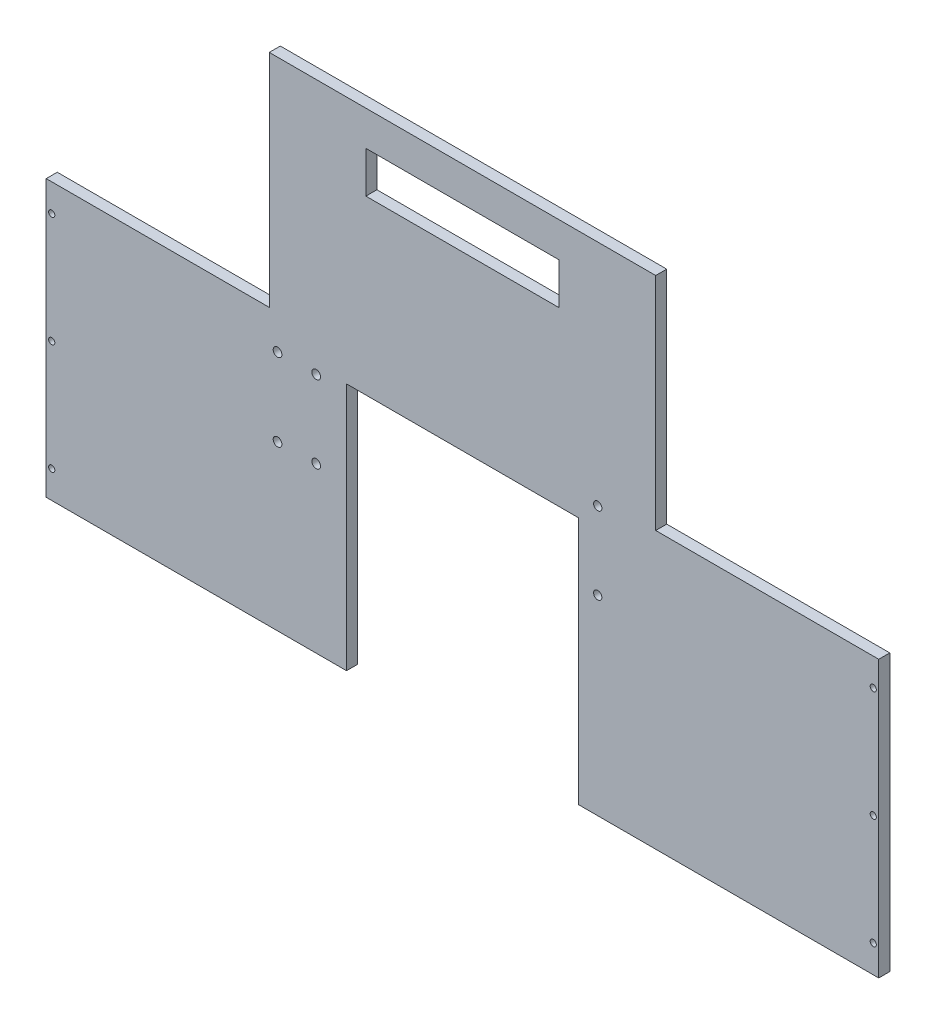
ISO-10303-21;
HEADER;
FILE_DESCRIPTION(('STEP AP214'),'2;1');
FILE_NAME('part.step','',(''),(''),'','','');
FILE_SCHEMA(('AUTOMOTIVE_DESIGN { 1 0 10303 214 1 1 1 1 }'));
ENDSEC;
DATA;
#1=APPLICATION_CONTEXT('core data for automotive mechanical design processes');
#2=APPLICATION_PROTOCOL_DEFINITION('international standard','automotive_design',2000,#1);
#3=PRODUCT_CONTEXT('',#1,'mechanical');
#4=PRODUCT('Part','Part','',(#3));
#5=PRODUCT_RELATED_PRODUCT_CATEGORY('part','',(#4));
#6=PRODUCT_DEFINITION_FORMATION('','',#4);
#7=PRODUCT_DEFINITION_CONTEXT('part definition',#1,'design');
#8=PRODUCT_DEFINITION('design','',#6,#7);
#9=PRODUCT_DEFINITION_SHAPE('','',#8);
#10=(LENGTH_UNIT() NAMED_UNIT(*) SI_UNIT(.MILLI.,.METRE.));
#11=(NAMED_UNIT(*) PLANE_ANGLE_UNIT() SI_UNIT($,.RADIAN.));
#12=(NAMED_UNIT(*) SI_UNIT($,.STERADIAN.) SOLID_ANGLE_UNIT());
#13=UNCERTAINTY_MEASURE_WITH_UNIT(LENGTH_MEASURE(1.E-05),#10,'distance_accuracy_value','');
#14=(GEOMETRIC_REPRESENTATION_CONTEXT(3) GLOBAL_UNCERTAINTY_ASSIGNED_CONTEXT((#13)) GLOBAL_UNIT_ASSIGNED_CONTEXT((#10,
#11,#12)) REPRESENTATION_CONTEXT('',''));
#15=CARTESIAN_POINT('',(0.,0.,0.));
#16=DIRECTION('',(0.,0.,1.));
#17=DIRECTION('',(1.,0.,0.));
#18=AXIS2_PLACEMENT_3D('',#15,#16,#17);
#19=CARTESIAN_POINT('',(0.,0.,5.08));
#20=DIRECTION('',(1.,0.,0.));
#21=DIRECTION('',(0.,1.,0.));
#22=AXIS2_PLACEMENT_3D('',#19,#20,#21);
#23=PLANE('',#22);
#24=DIRECTION('',(0.,0.,-1.));
#25=VECTOR('',#24,1.);
#26=CARTESIAN_POINT('',(0.,127.,5.08));
#27=LINE('',#26,#25);
#28=CARTESIAN_POINT('',(0.,127.,5.08));
#29=VERTEX_POINT('',#28);
#30=CARTESIAN_POINT('',(0.,127.,0.));
#31=VERTEX_POINT('',#30);
#32=EDGE_CURVE('E238',#29,#31,#27,.T.);
#33=ORIENTED_EDGE('',*,*,#32,.F.);
#34=DIRECTION('',(0.,-1.,0.));
#35=VECTOR('',#34,1.);
#36=CARTESIAN_POINT('',(0.,0.,5.08));
#37=LINE('',#36,#35);
#38=CARTESIAN_POINT('',(0.,228.6,5.08));
#39=VERTEX_POINT('',#38);
#40=EDGE_CURVE('E345',#39,#29,#37,.T.);
#41=ORIENTED_EDGE('',*,*,#40,.F.);
#42=DIRECTION('',(0.,0.,-1.));
#43=VECTOR('',#42,1.);
#44=CARTESIAN_POINT('',(0.,228.6,5.08));
#45=LINE('',#44,#43);
#46=CARTESIAN_POINT('',(0.,228.6,0.));
#47=VERTEX_POINT('',#46);
#48=EDGE_CURVE('E349',#39,#47,#45,.T.);
#49=ORIENTED_EDGE('',*,*,#48,.T.);
#50=DIRECTION('',(0.,-1.,0.));
#51=VECTOR('',#50,1.);
#52=CARTESIAN_POINT('',(0.,0.,0.));
#53=LINE('',#52,#51);
#54=EDGE_CURVE('E327',#47,#31,#53,.T.);
#55=ORIENTED_EDGE('',*,*,#54,.T.);
#56=EDGE_LOOP('',(#33,#41,#49,#55));
#57=FACE_BOUND('',#56,.T.);
#58=ADVANCED_FACE('F57',(#57),#23,.F.);
#59=CARTESIAN_POINT('',(35.56,0.,5.08));
#60=DIRECTION('',(0.,1.,0.));
#61=DIRECTION('',(-1.,0.,0.));
#62=AXIS2_PLACEMENT_3D('',#59,#60,#61);
#63=PLANE('',#62);
#64=DIRECTION('',(1.,0.,0.));
#65=VECTOR('',#64,1.);
#66=CARTESIAN_POINT('',(35.56,0.,0.));
#67=LINE('',#66,#65);
#68=CARTESIAN_POINT('',(-102.616,0.,0.));
#69=VERTEX_POINT('',#68);
#70=CARTESIAN_POINT('',(35.56,0.,0.));
#71=VERTEX_POINT('',#70);
#72=EDGE_CURVE('E318',#69,#71,#67,.T.);
#73=ORIENTED_EDGE('',*,*,#72,.T.);
#74=DIRECTION('',(0.,0.,-1.));
#75=VECTOR('',#74,1.);
#76=CARTESIAN_POINT('',(35.56,0.,5.08));
#77=LINE('',#76,#75);
#78=CARTESIAN_POINT('',(35.56,0.,5.08));
#79=VERTEX_POINT('',#78);
#80=EDGE_CURVE('E12',#79,#71,#77,.T.);
#81=ORIENTED_EDGE('',*,*,#80,.F.);
#82=DIRECTION('',(1.,0.,0.));
#83=VECTOR('',#82,1.);
#84=CARTESIAN_POINT('',(35.56,0.,5.08));
#85=LINE('',#84,#83);
#86=CARTESIAN_POINT('',(-102.616,0.,5.08));
#87=VERTEX_POINT('',#86);
#88=EDGE_CURVE('E322',#87,#79,#85,.T.);
#89=ORIENTED_EDGE('',*,*,#88,.F.);
#90=DIRECTION('',(0.,0.,-1.));
#91=VECTOR('',#90,1.);
#92=CARTESIAN_POINT('',(-102.616,0.,5.08));
#93=LINE('',#92,#91);
#94=EDGE_CURVE('E229',#87,#69,#93,.T.);
#95=ORIENTED_EDGE('',*,*,#94,.T.);
#96=EDGE_LOOP('',(#73,#81,#89,#95));
#97=FACE_BOUND('',#96,.T.);
#98=ADVANCED_FACE('F59',(#97),#63,.F.);
#99=CARTESIAN_POINT('',(35.56,114.3,5.08));
#100=DIRECTION('',(-1.,0.,0.));
#101=DIRECTION('',(0.,-1.,0.));
#102=AXIS2_PLACEMENT_3D('',#99,#100,#101);
#103=PLANE('',#102);
#104=DIRECTION('',(0.,1.,0.));
#105=VECTOR('',#104,1.);
#106=CARTESIAN_POINT('',(35.56,114.3,0.));
#107=LINE('',#106,#105);
#108=CARTESIAN_POINT('',(35.56,114.3,0.));
#109=VERTEX_POINT('',#108);
#110=EDGE_CURVE('E353',#71,#109,#107,.T.);
#111=ORIENTED_EDGE('',*,*,#110,.T.);
#112=DIRECTION('',(0.,0.,-1.));
#113=VECTOR('',#112,1.);
#114=CARTESIAN_POINT('',(35.56,114.3,5.08));
#115=LINE('',#114,#113);
#116=CARTESIAN_POINT('',(35.56,114.3,5.08));
#117=VERTEX_POINT('',#116);
#118=EDGE_CURVE('E66',#117,#109,#115,.T.);
#119=ORIENTED_EDGE('',*,*,#118,.F.);
#120=DIRECTION('',(0.,1.,0.));
#121=VECTOR('',#120,1.);
#122=CARTESIAN_POINT('',(35.56,114.3,5.08));
#123=LINE('',#122,#121);
#124=EDGE_CURVE('E326',#79,#117,#123,.T.);
#125=ORIENTED_EDGE('',*,*,#124,.F.);
#126=ORIENTED_EDGE('',*,*,#80,.T.);
#127=EDGE_LOOP('',(#111,#119,#125,#126));
#128=FACE_BOUND('',#127,.T.);
#129=ADVANCED_FACE('F413',(#128),#103,.F.);
#130=CARTESIAN_POINT('',(142.24,114.3,5.08));
#131=DIRECTION('',(0.,1.,0.));
#132=DIRECTION('',(-1.,0.,0.));
#133=AXIS2_PLACEMENT_3D('',#130,#131,#132);
#134=PLANE('',#133);
#135=DIRECTION('',(1.,0.,0.));
#136=VECTOR('',#135,1.);
#137=CARTESIAN_POINT('',(142.24,114.3,0.));
#138=LINE('',#137,#136);
#139=CARTESIAN_POINT('',(142.24,114.3,0.));
#140=VERTEX_POINT('',#139);
#141=EDGE_CURVE('E356',#109,#140,#138,.T.);
#142=ORIENTED_EDGE('',*,*,#141,.T.);
#143=DIRECTION('',(0.,0.,-1.));
#144=VECTOR('',#143,1.);
#145=CARTESIAN_POINT('',(142.24,114.3,5.08));
#146=LINE('',#145,#144);
#147=CARTESIAN_POINT('',(142.24,114.3,5.08));
#148=VERTEX_POINT('',#147);
#149=EDGE_CURVE('E384',#148,#140,#146,.T.);
#150=ORIENTED_EDGE('',*,*,#149,.F.);
#151=DIRECTION('',(1.,0.,0.));
#152=VECTOR('',#151,1.);
#153=CARTESIAN_POINT('',(142.24,114.3,5.08));
#154=LINE('',#153,#152);
#155=EDGE_CURVE('E330',#117,#148,#154,.T.);
#156=ORIENTED_EDGE('',*,*,#155,.F.);
#157=ORIENTED_EDGE('',*,*,#118,.T.);
#158=EDGE_LOOP('',(#142,#150,#156,#157));
#159=FACE_BOUND('',#158,.T.);
#160=ADVANCED_FACE('F393',(#159),#134,.F.);
#161=CARTESIAN_POINT('',(142.24,0.,5.08));
#162=DIRECTION('',(1.,0.,0.));
#163=DIRECTION('',(0.,0.,-1.));
#164=AXIS2_PLACEMENT_3D('',#161,#162,#163);
#165=PLANE('',#164);
#166=DIRECTION('',(0.,-1.,0.));
#167=VECTOR('',#166,1.);
#168=CARTESIAN_POINT('',(142.24,0.,0.));
#169=LINE('',#168,#167);
#170=CARTESIAN_POINT('',(142.24,0.,0.));
#171=VERTEX_POINT('',#170);
#172=EDGE_CURVE('E359',#140,#171,#169,.T.);
#173=ORIENTED_EDGE('',*,*,#172,.T.);
#174=DIRECTION('',(0.,0.,-1.));
#175=VECTOR('',#174,1.);
#176=CARTESIAN_POINT('',(142.24,0.,5.08));
#177=LINE('',#176,#175);
#178=CARTESIAN_POINT('',(142.24,0.,5.08));
#179=VERTEX_POINT('',#178);
#180=EDGE_CURVE('E380',#179,#171,#177,.T.);
#181=ORIENTED_EDGE('',*,*,#180,.F.);
#182=DIRECTION('',(0.,-1.,0.));
#183=VECTOR('',#182,1.);
#184=CARTESIAN_POINT('',(142.24,0.,5.08));
#185=LINE('',#184,#183);
#186=EDGE_CURVE('E333',#148,#179,#185,.T.);
#187=ORIENTED_EDGE('',*,*,#186,.F.);
#188=ORIENTED_EDGE('',*,*,#149,.T.);
#189=EDGE_LOOP('',(#173,#181,#187,#188));
#190=FACE_BOUND('',#189,.T.);
#191=ADVANCED_FACE('F401',(#190),#165,.F.);
#192=CARTESIAN_POINT('',(177.8,0.,5.08));
#193=DIRECTION('',(0.,1.,0.));
#194=DIRECTION('',(-1.,0.,0.));
#195=AXIS2_PLACEMENT_3D('',#192,#193,#194);
#196=PLANE('',#195);
#197=DIRECTION('',(1.,0.,0.));
#198=VECTOR('',#197,1.);
#199=CARTESIAN_POINT('',(177.8,0.,0.));
#200=LINE('',#199,#198);
#201=CARTESIAN_POINT('',(280.416,0.,0.));
#202=VERTEX_POINT('',#201);
#203=EDGE_CURVE('E362',#171,#202,#200,.T.);
#204=ORIENTED_EDGE('',*,*,#203,.T.);
#205=DIRECTION('',(0.,0.,-1.));
#206=VECTOR('',#205,1.);
#207=CARTESIAN_POINT('',(280.416,0.,5.08));
#208=LINE('',#207,#206);
#209=CARTESIAN_POINT('',(280.416,0.,5.08));
#210=VERTEX_POINT('',#209);
#211=EDGE_CURVE('E219',#210,#202,#208,.T.);
#212=ORIENTED_EDGE('',*,*,#211,.F.);
#213=DIRECTION('',(1.,0.,0.));
#214=VECTOR('',#213,1.);
#215=CARTESIAN_POINT('',(177.8,0.,5.08));
#216=LINE('',#215,#214);
#217=EDGE_CURVE('E336',#179,#210,#216,.T.);
#218=ORIENTED_EDGE('',*,*,#217,.F.);
#219=ORIENTED_EDGE('',*,*,#180,.T.);
#220=EDGE_LOOP('',(#204,#212,#218,#219));
#221=FACE_BOUND('',#220,.T.);
#222=ADVANCED_FACE('F405',(#221),#196,.F.);
#223=CARTESIAN_POINT('',(177.8,228.6,5.08));
#224=DIRECTION('',(-1.,0.,0.));
#225=DIRECTION('',(0.,-1.,0.));
#226=AXIS2_PLACEMENT_3D('',#223,#224,#225);
#227=PLANE('',#226);
#228=DIRECTION('',(0.,1.,0.));
#229=VECTOR('',#228,1.);
#230=CARTESIAN_POINT('',(177.8,228.6,5.08));
#231=LINE('',#230,#229);
#232=CARTESIAN_POINT('',(177.8,127.,5.08));
#233=VERTEX_POINT('',#232);
#234=CARTESIAN_POINT('',(177.8,228.6,5.08));
#235=VERTEX_POINT('',#234);
#236=EDGE_CURVE('E339',#233,#235,#231,.T.);
#237=ORIENTED_EDGE('',*,*,#236,.F.);
#238=DIRECTION('',(0.,0.,-1.));
#239=VECTOR('',#238,1.);
#240=CARTESIAN_POINT('',(177.8,127.,5.08));
#241=LINE('',#240,#239);
#242=CARTESIAN_POINT('',(177.8,127.,0.));
#243=VERTEX_POINT('',#242);
#244=EDGE_CURVE('E249',#233,#243,#241,.T.);
#245=ORIENTED_EDGE('',*,*,#244,.T.);
#246=DIRECTION('',(0.,1.,0.));
#247=VECTOR('',#246,1.);
#248=CARTESIAN_POINT('',(177.8,228.6,0.));
#249=LINE('',#248,#247);
#250=CARTESIAN_POINT('',(177.8,228.6,0.));
#251=VERTEX_POINT('',#250);
#252=EDGE_CURVE('E365',#243,#251,#249,.T.);
#253=ORIENTED_EDGE('',*,*,#252,.T.);
#254=DIRECTION('',(0.,0.,-1.));
#255=VECTOR('',#254,1.);
#256=CARTESIAN_POINT('',(177.8,228.6,5.08));
#257=LINE('',#256,#255);
#258=EDGE_CURVE('E376',#235,#251,#257,.T.);
#259=ORIENTED_EDGE('',*,*,#258,.F.);
#260=EDGE_LOOP('',(#237,#245,#253,#259));
#261=FACE_BOUND('',#260,.T.);
#262=ADVANCED_FACE('F434',(#261),#227,.F.);
#263=CARTESIAN_POINT('',(0.,228.6,5.08));
#264=DIRECTION('',(0.,-1.,0.));
#265=DIRECTION('',(1.,0.,0.));
#266=AXIS2_PLACEMENT_3D('',#263,#264,#265);
#267=PLANE('',#266);
#268=DIRECTION('',(-1.,0.,0.));
#269=VECTOR('',#268,1.);
#270=CARTESIAN_POINT('',(0.,228.6,0.));
#271=LINE('',#270,#269);
#272=EDGE_CURVE('E368',#251,#47,#271,.T.);
#273=ORIENTED_EDGE('',*,*,#272,.T.);
#274=ORIENTED_EDGE('',*,*,#48,.F.);
#275=DIRECTION('',(-1.,0.,0.));
#276=VECTOR('',#275,1.);
#277=CARTESIAN_POINT('',(0.,228.6,5.08));
#278=LINE('',#277,#276);
#279=EDGE_CURVE('E342',#235,#39,#278,.T.);
#280=ORIENTED_EDGE('',*,*,#279,.F.);
#281=ORIENTED_EDGE('',*,*,#258,.T.);
#282=EDGE_LOOP('',(#273,#274,#280,#281));
#283=FACE_BOUND('',#282,.T.);
#284=ADVANCED_FACE('F430',(#283),#267,.F.);
#285=CARTESIAN_POINT('',(0.,0.,5.08));
#286=DIRECTION('',(0.,0.,-1.));
#287=DIRECTION('',(-1.,0.,0.));
#288=AXIS2_PLACEMENT_3D('',#285,#286,#287);
#289=PLANE('',#288);
#290=CARTESIAN_POINT('',(277.876,12.7,5.08));
#291=DIRECTION('',(0.,0.,-1.));
#292=DIRECTION('',(-1.,0.,0.));
#293=AXIS2_PLACEMENT_3D('',#290,#291,#292);
#294=CIRCLE('',#293,1.42239999999999);
#295=CARTESIAN_POINT('',(276.4536,12.7,5.08));
#296=VERTEX_POINT('',#295);
#297=EDGE_CURVE('E714',#296,#296,#294,.T.);
#298=ORIENTED_EDGE('',*,*,#297,.T.);
#299=EDGE_LOOP('',(#298));
#300=FACE_BOUND('',#299,.T.);
#301=CARTESIAN_POINT('',(277.876,114.3,5.08));
#302=DIRECTION('',(0.,0.,-1.));
#303=DIRECTION('',(-1.,0.,0.));
#304=AXIS2_PLACEMENT_3D('',#301,#302,#303);
#305=CIRCLE('',#304,1.4224);
#306=CARTESIAN_POINT('',(276.4536,114.3,5.08));
#307=VERTEX_POINT('',#306);
#308=EDGE_CURVE('E716',#307,#307,#305,.T.);
#309=ORIENTED_EDGE('',*,*,#308,.T.);
#310=EDGE_LOOP('',(#309));
#311=FACE_BOUND('',#310,.T.);
#312=CARTESIAN_POINT('',(277.876,63.5,5.08));
#313=DIRECTION('',(0.,0.,-1.));
#314=DIRECTION('',(-1.,0.,0.));
#315=AXIS2_PLACEMENT_3D('',#312,#313,#314);
#316=CIRCLE('',#315,1.4224);
#317=CARTESIAN_POINT('',(276.4536,63.5,5.08));
#318=VERTEX_POINT('',#317);
#319=EDGE_CURVE('E721',#318,#318,#316,.T.);
#320=ORIENTED_EDGE('',*,*,#319,.T.);
#321=EDGE_LOOP('',(#320));
#322=FACE_BOUND('',#321,.T.);
#323=CARTESIAN_POINT('',(-100.076,114.3,5.08));
#324=DIRECTION('',(0.,0.,-1.));
#325=DIRECTION('',(-1.,0.,0.));
#326=AXIS2_PLACEMENT_3D('',#323,#324,#325);
#327=CIRCLE('',#326,1.42240000000004);
#328=CARTESIAN_POINT('',(-101.4984,114.3,5.08));
#329=VERTEX_POINT('',#328);
#330=EDGE_CURVE('E727',#329,#329,#327,.T.);
#331=ORIENTED_EDGE('',*,*,#330,.T.);
#332=EDGE_LOOP('',(#331));
#333=FACE_BOUND('',#332,.T.);
#334=CARTESIAN_POINT('',(-100.076,63.5,5.08));
#335=DIRECTION('',(0.,0.,-1.));
#336=DIRECTION('',(-1.,0.,0.));
#337=AXIS2_PLACEMENT_3D('',#334,#335,#336);
#338=CIRCLE('',#337,1.42240000000001);
#339=CARTESIAN_POINT('',(-101.4984,63.5,5.08));
#340=VERTEX_POINT('',#339);
#341=EDGE_CURVE('E731',#340,#340,#338,.T.);
#342=ORIENTED_EDGE('',*,*,#341,.T.);
#343=EDGE_LOOP('',(#342));
#344=FACE_BOUND('',#343,.T.);
#345=CARTESIAN_POINT('',(-100.076,12.7,5.08));
#346=DIRECTION('',(0.,0.,-1.));
#347=DIRECTION('',(-1.,0.,0.));
#348=AXIS2_PLACEMENT_3D('',#345,#346,#347);
#349=CIRCLE('',#348,1.42240000000002);
#350=CARTESIAN_POINT('',(-101.4984,12.7,5.08));
#351=VERTEX_POINT('',#350);
#352=EDGE_CURVE('E735',#351,#351,#349,.T.);
#353=ORIENTED_EDGE('',*,*,#352,.T.);
#354=EDGE_LOOP('',(#353));
#355=FACE_BOUND('',#354,.T.);
#356=DIRECTION('',(1.,0.,0.));
#357=VECTOR('',#356,1.);
#358=CARTESIAN_POINT('',(0.,212.598,5.08));
#359=LINE('',#358,#357);
#360=CARTESIAN_POINT('',(44.45,212.598,5.08));
#361=VERTEX_POINT('',#360);
#362=CARTESIAN_POINT('',(133.35,212.598,5.08));
#363=VERTEX_POINT('',#362);
#364=EDGE_CURVE('E211',#361,#363,#359,.T.);
#365=ORIENTED_EDGE('',*,*,#364,.T.);
#366=DIRECTION('',(0.,-1.,0.));
#367=VECTOR('',#366,1.);
#368=CARTESIAN_POINT('',(133.35,0.,5.08));
#369=LINE('',#368,#367);
#370=CARTESIAN_POINT('',(133.35,193.548,5.08));
#371=VERTEX_POINT('',#370);
#372=EDGE_CURVE('E215',#363,#371,#369,.T.);
#373=ORIENTED_EDGE('',*,*,#372,.T.);
#374=DIRECTION('',(-1.,0.,0.));
#375=VECTOR('',#374,1.);
#376=CARTESIAN_POINT('',(0.,193.548,5.08));
#377=LINE('',#376,#375);
#378=CARTESIAN_POINT('',(44.45,193.548,5.08));
#379=VERTEX_POINT('',#378);
#380=EDGE_CURVE('E202',#371,#379,#377,.T.);
#381=ORIENTED_EDGE('',*,*,#380,.T.);
#382=DIRECTION('',(0.,1.,0.));
#383=VECTOR('',#382,1.);
#384=CARTESIAN_POINT('',(44.45,0.,5.08));
#385=LINE('',#384,#383);
#386=EDGE_CURVE('E177',#379,#361,#385,.T.);
#387=ORIENTED_EDGE('',*,*,#386,.T.);
#388=EDGE_LOOP('',(#365,#373,#381,#387));
#389=FACE_BOUND('',#388,.T.);
#390=CARTESIAN_POINT('',(151.122459790118,123.444,5.08));
#391=DIRECTION('',(0.,0.,-1.));
#392=DIRECTION('',(-1.,0.,0.));
#393=AXIS2_PLACEMENT_3D('',#390,#391,#392);
#394=CIRCLE('',#393,1.90499999999999);
#395=CARTESIAN_POINT('',(149.217459790118,123.444,5.08));
#396=VERTEX_POINT('',#395);
#397=EDGE_CURVE('E274',#396,#396,#394,.T.);
#398=ORIENTED_EDGE('',*,*,#397,.T.);
#399=EDGE_LOOP('',(#398));
#400=FACE_BOUND('',#399,.T.);
#401=CARTESIAN_POINT('',(151.122459790118,87.884,5.08));
#402=DIRECTION('',(0.,0.,-1.));
#403=DIRECTION('',(-1.,0.,0.));
#404=AXIS2_PLACEMENT_3D('',#401,#402,#403);
#405=CIRCLE('',#404,1.90499999999999);
#406=CARTESIAN_POINT('',(149.217459790118,87.884,5.08));
#407=VERTEX_POINT('',#406);
#408=EDGE_CURVE('E283',#407,#407,#405,.T.);
#409=ORIENTED_EDGE('',*,*,#408,.T.);
#410=EDGE_LOOP('',(#409));
#411=FACE_BOUND('',#410,.T.);
#412=CARTESIAN_POINT('',(21.59,111.071616711567,5.08));
#413=DIRECTION('',(0.,0.,-1.));
#414=DIRECTION('',(-1.,0.,0.));
#415=AXIS2_PLACEMENT_3D('',#412,#413,#414);
#416=CIRCLE('',#415,2.);
#417=CARTESIAN_POINT('',(19.59,111.071616711567,5.08));
#418=VERTEX_POINT('',#417);
#419=EDGE_CURVE('E303',#418,#418,#416,.T.);
#420=ORIENTED_EDGE('',*,*,#419,.T.);
#421=EDGE_LOOP('',(#420));
#422=FACE_BOUND('',#421,.T.);
#423=CARTESIAN_POINT('',(3.81102803840513,75.3204205065202,5.08));
#424=DIRECTION('',(0.,0.,-1.));
#425=DIRECTION('',(-1.,0.,0.));
#426=AXIS2_PLACEMENT_3D('',#423,#424,#425);
#427=CIRCLE('',#426,2.00000000000001);
#428=CARTESIAN_POINT('',(1.81102803840513,75.3204205065202,5.08));
#429=VERTEX_POINT('',#428);
#430=EDGE_CURVE('E294',#429,#429,#427,.T.);
#431=ORIENTED_EDGE('',*,*,#430,.T.);
#432=EDGE_LOOP('',(#431));
#433=FACE_BOUND('',#432,.T.);
#434=CARTESIAN_POINT('',(3.81102803840514,111.071616711567,5.08));
#435=DIRECTION('',(0.,0.,-1.));
#436=DIRECTION('',(-1.,0.,0.));
#437=AXIS2_PLACEMENT_3D('',#434,#435,#436);
#438=CIRCLE('',#437,2.00000000000001);
#439=CARTESIAN_POINT('',(1.81102803840513,111.071616711567,5.08));
#440=VERTEX_POINT('',#439);
#441=EDGE_CURVE('E278',#440,#440,#438,.T.);
#442=ORIENTED_EDGE('',*,*,#441,.T.);
#443=EDGE_LOOP('',(#442));
#444=FACE_BOUND('',#443,.T.);
#445=CARTESIAN_POINT('',(21.59,75.511616711567,5.08));
#446=DIRECTION('',(0.,0.,-1.));
#447=DIRECTION('',(-1.,0.,0.));
#448=AXIS2_PLACEMENT_3D('',#445,#446,#447);
#449=CIRCLE('',#448,2.00000000000001);
#450=CARTESIAN_POINT('',(19.59,75.511616711567,5.08));
#451=VERTEX_POINT('',#450);
#452=EDGE_CURVE('E314',#451,#451,#449,.T.);
#453=ORIENTED_EDGE('',*,*,#452,.T.);
#454=EDGE_LOOP('',(#453));
#455=FACE_BOUND('',#454,.T.);
#456=ORIENTED_EDGE('',*,*,#88,.T.);
#457=ORIENTED_EDGE('',*,*,#124,.T.);
#458=ORIENTED_EDGE('',*,*,#155,.T.);
#459=ORIENTED_EDGE('',*,*,#186,.T.);
#460=ORIENTED_EDGE('',*,*,#217,.T.);
#461=DIRECTION('',(0.,-1.,0.));
#462=VECTOR('',#461,1.);
#463=CARTESIAN_POINT('',(280.416,127.,5.08));
#464=LINE('',#463,#462);
#465=CARTESIAN_POINT('',(280.416,127.,5.08));
#466=VERTEX_POINT('',#465);
#467=EDGE_CURVE('E253',#466,#210,#464,.T.);
#468=ORIENTED_EDGE('',*,*,#467,.F.);
#469=DIRECTION('',(1.,0.,0.));
#470=VECTOR('',#469,1.);
#471=CARTESIAN_POINT('',(177.8,127.,5.08));
#472=LINE('',#471,#470);
#473=EDGE_CURVE('E264',#233,#466,#472,.T.);
#474=ORIENTED_EDGE('',*,*,#473,.F.);
#475=ORIENTED_EDGE('',*,*,#236,.T.);
#476=ORIENTED_EDGE('',*,*,#279,.T.);
#477=ORIENTED_EDGE('',*,*,#40,.T.);
#478=DIRECTION('',(1.,0.,0.));
#479=VECTOR('',#478,1.);
#480=CARTESIAN_POINT('',(0.,127.,5.08));
#481=LINE('',#480,#479);
#482=CARTESIAN_POINT('',(-102.616,127.,5.08));
#483=VERTEX_POINT('',#482);
#484=EDGE_CURVE('E224',#483,#29,#481,.T.);
#485=ORIENTED_EDGE('',*,*,#484,.F.);
#486=DIRECTION('',(0.,1.,0.));
#487=VECTOR('',#486,1.);
#488=CARTESIAN_POINT('',(-102.616,127.,5.08));
#489=LINE('',#488,#487);
#490=EDGE_CURVE('E220',#87,#483,#489,.T.);
#491=ORIENTED_EDGE('',*,*,#490,.F.);
#492=EDGE_LOOP('',(#456,#457,#458,#459,#460,#468,#474,#475,#476,#477,#485,#491));
#493=FACE_BOUND('',#492,.T.);
#494=ADVANCED_FACE('F409',(#300,#311,#322,#333,#344,#355,#389,#400,#411,#422,#433,#444,#455,
#493),#289,.F.);
#495=CARTESIAN_POINT('',(0.,0.,0.));
#496=DIRECTION('',(0.,0.,-1.));
#497=DIRECTION('',(-1.,0.,0.));
#498=AXIS2_PLACEMENT_3D('',#495,#496,#497);
#499=PLANE('',#498);
#500=CARTESIAN_POINT('',(277.876,12.7,0.));
#501=DIRECTION('',(0.,0.,-1.));
#502=DIRECTION('',(-1.,0.,0.));
#503=AXIS2_PLACEMENT_3D('',#500,#501,#502);
#504=CIRCLE('',#503,1.42239999999999);
#505=CARTESIAN_POINT('',(276.4536,12.7,0.));
#506=VERTEX_POINT('',#505);
#507=EDGE_CURVE('E711',#506,#506,#504,.T.);
#508=ORIENTED_EDGE('',*,*,#507,.F.);
#509=EDGE_LOOP('',(#508));
#510=FACE_BOUND('',#509,.T.);
#511=CARTESIAN_POINT('',(277.876,114.3,0.));
#512=DIRECTION('',(0.,0.,-1.));
#513=DIRECTION('',(-1.,0.,0.));
#514=AXIS2_PLACEMENT_3D('',#511,#512,#513);
#515=CIRCLE('',#514,1.4224);
#516=CARTESIAN_POINT('',(276.4536,114.3,0.));
#517=VERTEX_POINT('',#516);
#518=EDGE_CURVE('E746',#517,#517,#515,.T.);
#519=ORIENTED_EDGE('',*,*,#518,.F.);
#520=EDGE_LOOP('',(#519));
#521=FACE_BOUND('',#520,.T.);
#522=CARTESIAN_POINT('',(277.876,63.5,0.));
#523=DIRECTION('',(0.,0.,-1.));
#524=DIRECTION('',(-1.,0.,0.));
#525=AXIS2_PLACEMENT_3D('',#522,#523,#524);
#526=CIRCLE('',#525,1.4224);
#527=CARTESIAN_POINT('',(276.4536,63.5,0.));
#528=VERTEX_POINT('',#527);
#529=EDGE_CURVE('E750',#528,#528,#526,.T.);
#530=ORIENTED_EDGE('',*,*,#529,.F.);
#531=EDGE_LOOP('',(#530));
#532=FACE_BOUND('',#531,.T.);
#533=CARTESIAN_POINT('',(-100.076,114.3,0.));
#534=DIRECTION('',(0.,0.,-1.));
#535=DIRECTION('',(-1.,0.,0.));
#536=AXIS2_PLACEMENT_3D('',#533,#534,#535);
#537=CIRCLE('',#536,1.42240000000004);
#538=CARTESIAN_POINT('',(-101.4984,114.3,0.));
#539=VERTEX_POINT('',#538);
#540=EDGE_CURVE('E754',#539,#539,#537,.T.);
#541=ORIENTED_EDGE('',*,*,#540,.F.);
#542=EDGE_LOOP('',(#541));
#543=FACE_BOUND('',#542,.T.);
#544=CARTESIAN_POINT('',(-100.076,63.5,0.));
#545=DIRECTION('',(0.,0.,-1.));
#546=DIRECTION('',(-1.,0.,0.));
#547=AXIS2_PLACEMENT_3D('',#544,#545,#546);
#548=CIRCLE('',#547,1.42240000000001);
#549=CARTESIAN_POINT('',(-101.4984,63.5,0.));
#550=VERTEX_POINT('',#549);
#551=EDGE_CURVE('E743',#550,#550,#548,.T.);
#552=ORIENTED_EDGE('',*,*,#551,.F.);
#553=EDGE_LOOP('',(#552));
#554=FACE_BOUND('',#553,.T.);
#555=CARTESIAN_POINT('',(-100.076,12.7,0.));
#556=DIRECTION('',(0.,0.,-1.));
#557=DIRECTION('',(-1.,0.,0.));
#558=AXIS2_PLACEMENT_3D('',#555,#556,#557);
#559=CIRCLE('',#558,1.42240000000002);
#560=CARTESIAN_POINT('',(-101.4984,12.7,0.));
#561=VERTEX_POINT('',#560);
#562=EDGE_CURVE('E739',#561,#561,#559,.T.);
#563=ORIENTED_EDGE('',*,*,#562,.F.);
#564=EDGE_LOOP('',(#563));
#565=FACE_BOUND('',#564,.T.);
#566=DIRECTION('',(0.,-1.,0.));
#567=VECTOR('',#566,1.);
#568=CARTESIAN_POINT('',(133.35,212.598,0.));
#569=LINE('',#568,#567);
#570=CARTESIAN_POINT('',(133.35,212.598,0.));
#571=VERTEX_POINT('',#570);
#572=CARTESIAN_POINT('',(133.35,193.548,0.));
#573=VERTEX_POINT('',#572);
#574=EDGE_CURVE('E81',#571,#573,#569,.T.);
#575=ORIENTED_EDGE('',*,*,#574,.F.);
#576=DIRECTION('',(1.,0.,0.));
#577=VECTOR('',#576,1.);
#578=CARTESIAN_POINT('',(133.35,212.598,0.));
#579=LINE('',#578,#577);
#580=CARTESIAN_POINT('',(44.45,212.598,0.));
#581=VERTEX_POINT('',#580);
#582=EDGE_CURVE('E192',#581,#571,#579,.T.);
#583=ORIENTED_EDGE('',*,*,#582,.F.);
#584=DIRECTION('',(0.,1.,0.));
#585=VECTOR('',#584,1.);
#586=CARTESIAN_POINT('',(44.45,212.598,0.));
#587=LINE('',#586,#585);
#588=CARTESIAN_POINT('',(44.45,193.548,0.));
#589=VERTEX_POINT('',#588);
#590=EDGE_CURVE('E174',#589,#581,#587,.T.);
#591=ORIENTED_EDGE('',*,*,#590,.F.);
#592=DIRECTION('',(-1.,0.,0.));
#593=VECTOR('',#592,1.);
#594=CARTESIAN_POINT('',(133.35,193.548,0.));
#595=LINE('',#594,#593);
#596=EDGE_CURVE('E184',#573,#589,#595,.T.);
#597=ORIENTED_EDGE('',*,*,#596,.F.);
#598=EDGE_LOOP('',(#575,#583,#591,#597));
#599=FACE_BOUND('',#598,.T.);
#600=CARTESIAN_POINT('',(151.122459790118,123.444,0.));
#601=DIRECTION('',(0.,0.,-1.));
#602=DIRECTION('',(-1.,0.,0.));
#603=AXIS2_PLACEMENT_3D('',#600,#601,#602);
#604=CIRCLE('',#603,1.90499999999999);
#605=CARTESIAN_POINT('',(149.217459790118,123.444,0.));
#606=VERTEX_POINT('',#605);
#607=EDGE_CURVE('E279',#606,#606,#604,.T.);
#608=ORIENTED_EDGE('',*,*,#607,.F.);
#609=EDGE_LOOP('',(#608));
#610=FACE_BOUND('',#609,.T.);
#611=CARTESIAN_POINT('',(151.122459790118,87.884,0.));
#612=DIRECTION('',(0.,0.,-1.));
#613=DIRECTION('',(-1.,0.,0.));
#614=AXIS2_PLACEMENT_3D('',#611,#612,#613);
#615=CIRCLE('',#614,1.90499999999999);
#616=CARTESIAN_POINT('',(149.217459790118,87.884,0.));
#617=VERTEX_POINT('',#616);
#618=EDGE_CURVE('E242',#617,#617,#615,.T.);
#619=ORIENTED_EDGE('',*,*,#618,.F.);
#620=EDGE_LOOP('',(#619));
#621=FACE_BOUND('',#620,.T.);
#622=CARTESIAN_POINT('',(21.59,111.071616711567,0.));
#623=DIRECTION('',(0.,0.,-1.));
#624=DIRECTION('',(-1.,0.,0.));
#625=AXIS2_PLACEMENT_3D('',#622,#623,#624);
#626=CIRCLE('',#625,2.);
#627=CARTESIAN_POINT('',(19.59,111.071616711567,0.));
#628=VERTEX_POINT('',#627);
#629=EDGE_CURVE('E298',#628,#628,#626,.T.);
#630=ORIENTED_EDGE('',*,*,#629,.F.);
#631=EDGE_LOOP('',(#630));
#632=FACE_BOUND('',#631,.T.);
#633=CARTESIAN_POINT('',(3.81102803840513,75.3204205065202,0.));
#634=DIRECTION('',(0.,0.,-1.));
#635=DIRECTION('',(-1.,0.,0.));
#636=AXIS2_PLACEMENT_3D('',#633,#634,#635);
#637=CIRCLE('',#636,2.00000000000001);
#638=CARTESIAN_POINT('',(1.81102803840513,75.3204205065202,0.));
#639=VERTEX_POINT('',#638);
#640=EDGE_CURVE('E307',#639,#639,#637,.T.);
#641=ORIENTED_EDGE('',*,*,#640,.F.);
#642=EDGE_LOOP('',(#641));
#643=FACE_BOUND('',#642,.T.);
#644=CARTESIAN_POINT('',(3.81102803840514,111.071616711567,0.));
#645=DIRECTION('',(0.,0.,-1.));
#646=DIRECTION('',(-1.,0.,0.));
#647=AXIS2_PLACEMENT_3D('',#644,#645,#646);
#648=CIRCLE('',#647,2.00000000000001);
#649=CARTESIAN_POINT('',(1.81102803840513,111.071616711567,0.));
#650=VERTEX_POINT('',#649);
#651=EDGE_CURVE('E290',#650,#650,#648,.T.);
#652=ORIENTED_EDGE('',*,*,#651,.F.);
#653=EDGE_LOOP('',(#652));
#654=FACE_BOUND('',#653,.T.);
#655=CARTESIAN_POINT('',(21.59,75.511616711567,0.));
#656=DIRECTION('',(0.,0.,-1.));
#657=DIRECTION('',(-1.,0.,0.));
#658=AXIS2_PLACEMENT_3D('',#655,#656,#657);
#659=CIRCLE('',#658,2.00000000000001);
#660=CARTESIAN_POINT('',(19.59,75.511616711567,0.));
#661=VERTEX_POINT('',#660);
#662=EDGE_CURVE('E302',#661,#661,#659,.T.);
#663=ORIENTED_EDGE('',*,*,#662,.F.);
#664=EDGE_LOOP('',(#663));
#665=FACE_BOUND('',#664,.T.);
#666=ORIENTED_EDGE('',*,*,#72,.F.);
#667=DIRECTION('',(0.,1.,0.));
#668=VECTOR('',#667,1.);
#669=CARTESIAN_POINT('',(-102.616,127.,0.));
#670=LINE('',#669,#668);
#671=CARTESIAN_POINT('',(-102.616,127.,0.));
#672=VERTEX_POINT('',#671);
#673=EDGE_CURVE('E230',#69,#672,#670,.T.);
#674=ORIENTED_EDGE('',*,*,#673,.T.);
#675=DIRECTION('',(1.,0.,0.));
#676=VECTOR('',#675,1.);
#677=CARTESIAN_POINT('',(0.,127.,0.));
#678=LINE('',#677,#676);
#679=EDGE_CURVE('E225',#672,#31,#678,.T.);
#680=ORIENTED_EDGE('',*,*,#679,.T.);
#681=ORIENTED_EDGE('',*,*,#54,.F.);
#682=ORIENTED_EDGE('',*,*,#272,.F.);
#683=ORIENTED_EDGE('',*,*,#252,.F.);
#684=DIRECTION('',(1.,0.,0.));
#685=VECTOR('',#684,1.);
#686=CARTESIAN_POINT('',(177.8,127.,0.));
#687=LINE('',#686,#685);
#688=CARTESIAN_POINT('',(280.416,127.,0.));
#689=VERTEX_POINT('',#688);
#690=EDGE_CURVE('E234',#243,#689,#687,.T.);
#691=ORIENTED_EDGE('',*,*,#690,.T.);
#692=DIRECTION('',(0.,-1.,0.));
#693=VECTOR('',#692,1.);
#694=CARTESIAN_POINT('',(280.416,127.,0.));
#695=LINE('',#694,#693);
#696=EDGE_CURVE('E260',#689,#202,#695,.T.);
#697=ORIENTED_EDGE('',*,*,#696,.T.);
#698=ORIENTED_EDGE('',*,*,#203,.F.);
#699=ORIENTED_EDGE('',*,*,#172,.F.);
#700=ORIENTED_EDGE('',*,*,#141,.F.);
#701=ORIENTED_EDGE('',*,*,#110,.F.);
#702=EDGE_LOOP('',(#666,#674,#680,#681,#682,#683,#691,#697,#698,#699,#700,#701));
#703=FACE_BOUND('',#702,.T.);
#704=ADVANCED_FACE('F189',(#510,#521,#532,#543,#554,#565,#599,#610,#621,#632,#643,#654,#665,
#703),#499,.T.);
#705=CARTESIAN_POINT('',(21.59,75.511616711567,5.08));
#706=DIRECTION('',(0.,0.,-1.));
#707=DIRECTION('',(-1.,0.,0.));
#708=AXIS2_PLACEMENT_3D('',#705,#706,#707);
#709=CYLINDRICAL_SURFACE('',#708,2.00000000000001);
#710=ORIENTED_EDGE('',*,*,#452,.F.);
#711=EDGE_LOOP('',(#710));
#712=FACE_BOUND('',#711,.T.);
#713=ORIENTED_EDGE('',*,*,#662,.T.);
#714=EDGE_LOOP('',(#713));
#715=FACE_BOUND('',#714,.T.);
#716=ADVANCED_FACE('F495',(#712,#715),#709,.F.);
#717=CARTESIAN_POINT('',(3.81102803840514,111.071616711567,5.08));
#718=DIRECTION('',(0.,0.,-1.));
#719=DIRECTION('',(-1.,0.,0.));
#720=AXIS2_PLACEMENT_3D('',#717,#718,#719);
#721=CYLINDRICAL_SURFACE('',#720,2.00000000000001);
#722=ORIENTED_EDGE('',*,*,#441,.F.);
#723=EDGE_LOOP('',(#722));
#724=FACE_BOUND('',#723,.T.);
#725=ORIENTED_EDGE('',*,*,#651,.T.);
#726=EDGE_LOOP('',(#725));
#727=FACE_BOUND('',#726,.T.);
#728=ADVANCED_FACE('F499',(#724,#727),#721,.F.);
#729=CARTESIAN_POINT('',(3.81102803840513,75.3204205065202,5.08));
#730=DIRECTION('',(0.,0.,-1.));
#731=DIRECTION('',(-1.,0.,0.));
#732=AXIS2_PLACEMENT_3D('',#729,#730,#731);
#733=CYLINDRICAL_SURFACE('',#732,2.00000000000001);
#734=ORIENTED_EDGE('',*,*,#430,.F.);
#735=EDGE_LOOP('',(#734));
#736=FACE_BOUND('',#735,.T.);
#737=ORIENTED_EDGE('',*,*,#640,.T.);
#738=EDGE_LOOP('',(#737));
#739=FACE_BOUND('',#738,.T.);
#740=ADVANCED_FACE('F508',(#736,#739),#733,.F.);
#741=CARTESIAN_POINT('',(21.59,111.071616711567,5.08));
#742=DIRECTION('',(0.,0.,-1.));
#743=DIRECTION('',(-1.,0.,0.));
#744=AXIS2_PLACEMENT_3D('',#741,#742,#743);
#745=CYLINDRICAL_SURFACE('',#744,2.);
#746=ORIENTED_EDGE('',*,*,#419,.F.);
#747=EDGE_LOOP('',(#746));
#748=FACE_BOUND('',#747,.T.);
#749=ORIENTED_EDGE('',*,*,#629,.T.);
#750=EDGE_LOOP('',(#749));
#751=FACE_BOUND('',#750,.T.);
#752=ADVANCED_FACE('F517',(#748,#751),#745,.F.);
#753=CARTESIAN_POINT('',(151.122459790118,87.884,5.08));
#754=DIRECTION('',(0.,0.,-1.));
#755=DIRECTION('',(-1.,0.,0.));
#756=AXIS2_PLACEMENT_3D('',#753,#754,#755);
#757=CYLINDRICAL_SURFACE('',#756,1.90499999999999);
#758=ORIENTED_EDGE('',*,*,#408,.F.);
#759=EDGE_LOOP('',(#758));
#760=FACE_BOUND('',#759,.T.);
#761=ORIENTED_EDGE('',*,*,#618,.T.);
#762=EDGE_LOOP('',(#761));
#763=FACE_BOUND('',#762,.T.);
#764=ADVANCED_FACE('F527',(#760,#763),#757,.F.);
#765=CARTESIAN_POINT('',(151.122459790118,123.444,5.08));
#766=DIRECTION('',(0.,0.,-1.));
#767=DIRECTION('',(-1.,0.,0.));
#768=AXIS2_PLACEMENT_3D('',#765,#766,#767);
#769=CYLINDRICAL_SURFACE('',#768,1.90499999999999);
#770=ORIENTED_EDGE('',*,*,#397,.F.);
#771=EDGE_LOOP('',(#770));
#772=FACE_BOUND('',#771,.T.);
#773=ORIENTED_EDGE('',*,*,#607,.T.);
#774=EDGE_LOOP('',(#773));
#775=FACE_BOUND('',#774,.T.);
#776=ADVANCED_FACE('F534',(#772,#775),#769,.F.);
#777=CARTESIAN_POINT('',(0.,127.,5.08));
#778=DIRECTION('',(0.,1.,0.));
#779=DIRECTION('',(0.,0.,1.));
#780=AXIS2_PLACEMENT_3D('',#777,#778,#779);
#781=PLANE('',#780);
#782=ORIENTED_EDGE('',*,*,#679,.F.);
#783=DIRECTION('',(0.,0.,-1.));
#784=VECTOR('',#783,1.);
#785=CARTESIAN_POINT('',(-102.616,127.,5.08));
#786=LINE('',#785,#784);
#787=EDGE_CURVE('E243',#483,#672,#786,.T.);
#788=ORIENTED_EDGE('',*,*,#787,.F.);
#789=ORIENTED_EDGE('',*,*,#484,.T.);
#790=ORIENTED_EDGE('',*,*,#32,.T.);
#791=EDGE_LOOP('',(#782,#788,#789,#790));
#792=FACE_BOUND('',#791,.T.);
#793=ADVANCED_FACE('F421',(#792),#781,.T.);
#794=CARTESIAN_POINT('',(-102.616,127.,5.08));
#795=DIRECTION('',(-1.,0.,0.));
#796=DIRECTION('',(0.,-1.,0.));
#797=AXIS2_PLACEMENT_3D('',#794,#795,#796);
#798=PLANE('',#797);
#799=ORIENTED_EDGE('',*,*,#673,.F.);
#800=ORIENTED_EDGE('',*,*,#94,.F.);
#801=ORIENTED_EDGE('',*,*,#490,.T.);
#802=ORIENTED_EDGE('',*,*,#787,.T.);
#803=EDGE_LOOP('',(#799,#800,#801,#802));
#804=FACE_BOUND('',#803,.T.);
#805=ADVANCED_FACE('F441',(#804),#798,.T.);
#806=CARTESIAN_POINT('',(280.416,127.,5.08));
#807=DIRECTION('',(1.,0.,0.));
#808=DIRECTION('',(0.,0.,-1.));
#809=AXIS2_PLACEMENT_3D('',#806,#807,#808);
#810=PLANE('',#809);
#811=ORIENTED_EDGE('',*,*,#696,.F.);
#812=DIRECTION('',(0.,0.,-1.));
#813=VECTOR('',#812,1.);
#814=CARTESIAN_POINT('',(280.416,127.,5.08));
#815=LINE('',#814,#813);
#816=EDGE_CURVE('E254',#466,#689,#815,.T.);
#817=ORIENTED_EDGE('',*,*,#816,.F.);
#818=ORIENTED_EDGE('',*,*,#467,.T.);
#819=ORIENTED_EDGE('',*,*,#211,.T.);
#820=EDGE_LOOP('',(#811,#817,#818,#819));
#821=FACE_BOUND('',#820,.T.);
#822=ADVANCED_FACE('F439',(#821),#810,.T.);
#823=CARTESIAN_POINT('',(177.8,127.,5.08));
#824=DIRECTION('',(0.,1.,0.));
#825=DIRECTION('',(-1.,0.,0.));
#826=AXIS2_PLACEMENT_3D('',#823,#824,#825);
#827=PLANE('',#826);
#828=ORIENTED_EDGE('',*,*,#690,.F.);
#829=ORIENTED_EDGE('',*,*,#244,.F.);
#830=ORIENTED_EDGE('',*,*,#473,.T.);
#831=ORIENTED_EDGE('',*,*,#816,.T.);
#832=EDGE_LOOP('',(#828,#829,#830,#831));
#833=FACE_BOUND('',#832,.T.);
#834=ADVANCED_FACE('F436',(#833),#827,.T.);
#835=CARTESIAN_POINT('',(133.35,212.598,50.8));
#836=DIRECTION('',(1.,0.,0.));
#837=DIRECTION('',(0.,0.,-1.));
#838=AXIS2_PLACEMENT_3D('',#835,#836,#837);
#839=PLANE('',#838);
#840=DIRECTION('',(0.,0.,-1.));
#841=VECTOR('',#840,1.);
#842=CARTESIAN_POINT('',(133.35,212.598,50.8));
#843=LINE('',#842,#841);
#844=EDGE_CURVE('E199',#363,#571,#843,.T.);
#845=ORIENTED_EDGE('',*,*,#844,.T.);
#846=ORIENTED_EDGE('',*,*,#574,.T.);
#847=DIRECTION('',(0.,0.,-1.));
#848=VECTOR('',#847,1.);
#849=CARTESIAN_POINT('',(133.35,193.548,50.8));
#850=LINE('',#849,#848);
#851=EDGE_CURVE('E181',#371,#573,#850,.T.);
#852=ORIENTED_EDGE('',*,*,#851,.F.);
#853=ORIENTED_EDGE('',*,*,#372,.F.);
#854=EDGE_LOOP('',(#845,#846,#852,#853));
#855=FACE_BOUND('',#854,.T.);
#856=ADVANCED_FACE('F447',(#855),#839,.F.);
#857=CARTESIAN_POINT('',(133.35,212.598,50.8));
#858=DIRECTION('',(0.,1.,0.));
#859=DIRECTION('',(0.,0.,1.));
#860=AXIS2_PLACEMENT_3D('',#857,#858,#859);
#861=PLANE('',#860);
#862=DIRECTION('',(0.,0.,-1.));
#863=VECTOR('',#862,1.);
#864=CARTESIAN_POINT('',(44.45,212.598,50.8));
#865=LINE('',#864,#863);
#866=EDGE_CURVE('E180',#361,#581,#865,.T.);
#867=ORIENTED_EDGE('',*,*,#866,.T.);
#868=ORIENTED_EDGE('',*,*,#582,.T.);
#869=ORIENTED_EDGE('',*,*,#844,.F.);
#870=ORIENTED_EDGE('',*,*,#364,.F.);
#871=EDGE_LOOP('',(#867,#868,#869,#870));
#872=FACE_BOUND('',#871,.T.);
#873=ADVANCED_FACE('F622',(#872),#861,.F.);
#874=CARTESIAN_POINT('',(44.45,212.598,50.8));
#875=DIRECTION('',(-1.,0.,0.));
#876=DIRECTION('',(0.,0.,1.));
#877=AXIS2_PLACEMENT_3D('',#874,#875,#876);
#878=PLANE('',#877);
#879=DIRECTION('',(0.,0.,-1.));
#880=VECTOR('',#879,1.);
#881=CARTESIAN_POINT('',(44.45,193.548,50.8));
#882=LINE('',#881,#880);
#883=EDGE_CURVE('E73',#379,#589,#882,.T.);
#884=ORIENTED_EDGE('',*,*,#883,.T.);
#885=ORIENTED_EDGE('',*,*,#590,.T.);
#886=ORIENTED_EDGE('',*,*,#866,.F.);
#887=ORIENTED_EDGE('',*,*,#386,.F.);
#888=EDGE_LOOP('',(#884,#885,#886,#887));
#889=FACE_BOUND('',#888,.T.);
#890=ADVANCED_FACE('F171',(#889),#878,.F.);
#891=CARTESIAN_POINT('',(133.35,193.548,50.8));
#892=DIRECTION('',(0.,-1.,0.));
#893=DIRECTION('',(1.,0.,0.));
#894=AXIS2_PLACEMENT_3D('',#891,#892,#893);
#895=PLANE('',#894);
#896=ORIENTED_EDGE('',*,*,#851,.T.);
#897=ORIENTED_EDGE('',*,*,#596,.T.);
#898=ORIENTED_EDGE('',*,*,#883,.F.);
#899=ORIENTED_EDGE('',*,*,#380,.F.);
#900=EDGE_LOOP('',(#896,#897,#898,#899));
#901=FACE_BOUND('',#900,.T.);
#902=ADVANCED_FACE('F185',(#901),#895,.F.);
#903=CARTESIAN_POINT('',(-100.076,12.7,10.16));
#904=DIRECTION('',(0.,0.,-1.));
#905=DIRECTION('',(-1.,0.,0.));
#906=AXIS2_PLACEMENT_3D('',#903,#904,#905);
#907=CYLINDRICAL_SURFACE('',#906,1.42240000000002);
#908=ORIENTED_EDGE('',*,*,#562,.T.);
#909=EDGE_LOOP('',(#908));
#910=FACE_BOUND('',#909,.T.);
#911=ORIENTED_EDGE('',*,*,#352,.F.);
#912=EDGE_LOOP('',(#911));
#913=FACE_BOUND('',#912,.T.);
#914=ADVANCED_FACE('F647',(#910,#913),#907,.F.);
#915=CARTESIAN_POINT('',(-100.076,63.5,10.16));
#916=DIRECTION('',(0.,0.,-1.));
#917=DIRECTION('',(-1.,0.,0.));
#918=AXIS2_PLACEMENT_3D('',#915,#916,#917);
#919=CYLINDRICAL_SURFACE('',#918,1.42240000000001);
#920=ORIENTED_EDGE('',*,*,#551,.T.);
#921=EDGE_LOOP('',(#920));
#922=FACE_BOUND('',#921,.T.);
#923=ORIENTED_EDGE('',*,*,#341,.F.);
#924=EDGE_LOOP('',(#923));
#925=FACE_BOUND('',#924,.T.);
#926=ADVANCED_FACE('F655',(#922,#925),#919,.F.);
#927=CARTESIAN_POINT('',(-100.076,114.3,10.16));
#928=DIRECTION('',(0.,0.,-1.));
#929=DIRECTION('',(-1.,0.,0.));
#930=AXIS2_PLACEMENT_3D('',#927,#928,#929);
#931=CYLINDRICAL_SURFACE('',#930,1.42240000000004);
#932=ORIENTED_EDGE('',*,*,#540,.T.);
#933=EDGE_LOOP('',(#932));
#934=FACE_BOUND('',#933,.T.);
#935=ORIENTED_EDGE('',*,*,#330,.F.);
#936=EDGE_LOOP('',(#935));
#937=FACE_BOUND('',#936,.T.);
#938=ADVANCED_FACE('F665',(#934,#937),#931,.F.);
#939=CARTESIAN_POINT('',(277.876,63.5,10.16));
#940=DIRECTION('',(0.,0.,-1.));
#941=DIRECTION('',(-1.,0.,0.));
#942=AXIS2_PLACEMENT_3D('',#939,#940,#941);
#943=CYLINDRICAL_SURFACE('',#942,1.4224);
#944=ORIENTED_EDGE('',*,*,#529,.T.);
#945=EDGE_LOOP('',(#944));
#946=FACE_BOUND('',#945,.T.);
#947=ORIENTED_EDGE('',*,*,#319,.F.);
#948=EDGE_LOOP('',(#947));
#949=FACE_BOUND('',#948,.T.);
#950=ADVANCED_FACE('F675',(#946,#949),#943,.F.);
#951=CARTESIAN_POINT('',(277.876,114.3,10.16));
#952=DIRECTION('',(0.,0.,-1.));
#953=DIRECTION('',(-1.,0.,0.));
#954=AXIS2_PLACEMENT_3D('',#951,#952,#953);
#955=CYLINDRICAL_SURFACE('',#954,1.4224);
#956=ORIENTED_EDGE('',*,*,#518,.T.);
#957=EDGE_LOOP('',(#956));
#958=FACE_BOUND('',#957,.T.);
#959=ORIENTED_EDGE('',*,*,#308,.F.);
#960=EDGE_LOOP('',(#959));
#961=FACE_BOUND('',#960,.T.);
#962=ADVANCED_FACE('F685',(#958,#961),#955,.F.);
#963=CARTESIAN_POINT('',(277.876,12.7,10.16));
#964=DIRECTION('',(0.,0.,-1.));
#965=DIRECTION('',(-1.,0.,0.));
#966=AXIS2_PLACEMENT_3D('',#963,#964,#965);
#967=CYLINDRICAL_SURFACE('',#966,1.42239999999999);
#968=ORIENTED_EDGE('',*,*,#507,.T.);
#969=EDGE_LOOP('',(#968));
#970=FACE_BOUND('',#969,.T.);
#971=ORIENTED_EDGE('',*,*,#297,.F.);
#972=EDGE_LOOP('',(#971));
#973=FACE_BOUND('',#972,.T.);
#974=ADVANCED_FACE('F695',(#970,#973),#967,.F.);
#975=CLOSED_SHELL('',(#58,#98,#129,#160,#191,#222,#262,#284,#494,#704,#716,#728,#740,#752,#764,
#776,#793,#805,#822,#834,#856,#873,#890,#902,#914,#926,#938,#950,#962,#974));
#976=MANIFOLD_SOLID_BREP('B2',#975);
#977=ADVANCED_BREP_SHAPE_REPRESENTATION('',(#18,#976),#14);
#978=SHAPE_DEFINITION_REPRESENTATION(#9,#977);
ENDSEC;
END-ISO-10303-21;
